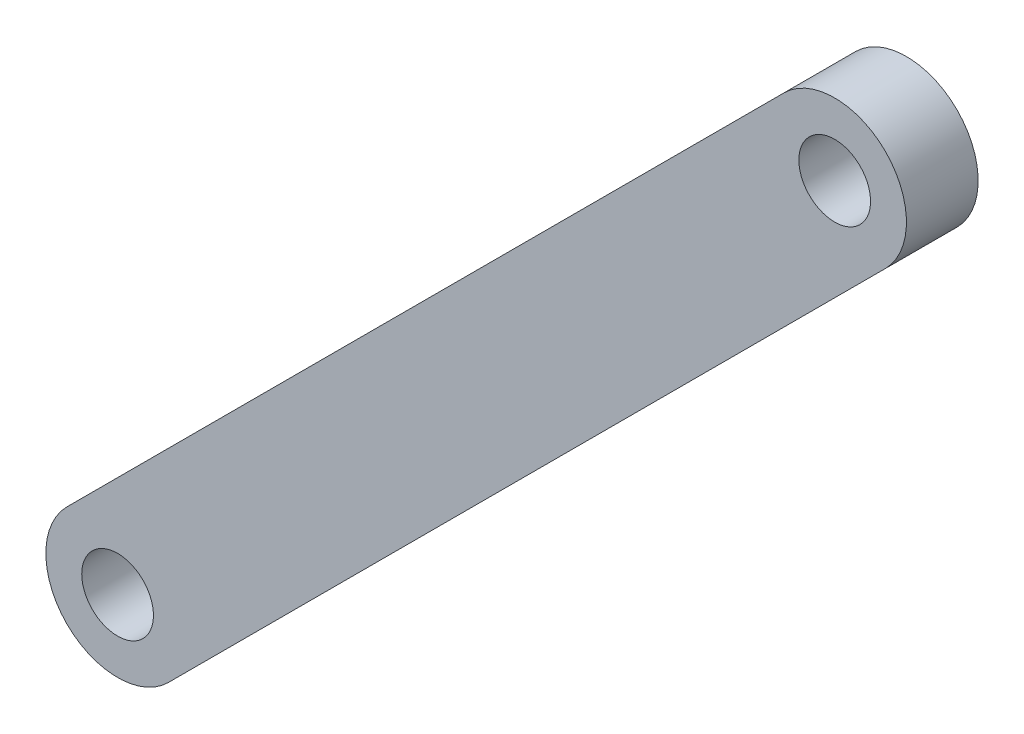
ISO-10303-21;
HEADER;
FILE_DESCRIPTION(('STEP AP214'),'2;1');
FILE_NAME('part.step','',(''),(''),'','','');
FILE_SCHEMA(('AUTOMOTIVE_DESIGN { 1 0 10303 214 1 1 1 1 }'));
ENDSEC;
DATA;
#1=APPLICATION_CONTEXT('core data for automotive mechanical design processes');
#2=APPLICATION_PROTOCOL_DEFINITION('international standard','automotive_design',2000,#1);
#3=PRODUCT_CONTEXT('',#1,'mechanical');
#4=PRODUCT('Part','Part','',(#3));
#5=PRODUCT_RELATED_PRODUCT_CATEGORY('part','',(#4));
#6=PRODUCT_DEFINITION_FORMATION('','',#4);
#7=PRODUCT_DEFINITION_CONTEXT('part definition',#1,'design');
#8=PRODUCT_DEFINITION('design','',#6,#7);
#9=PRODUCT_DEFINITION_SHAPE('','',#8);
#10=(LENGTH_UNIT() NAMED_UNIT(*) SI_UNIT(.MILLI.,.METRE.));
#11=(NAMED_UNIT(*) PLANE_ANGLE_UNIT() SI_UNIT($,.RADIAN.));
#12=(NAMED_UNIT(*) SI_UNIT($,.STERADIAN.) SOLID_ANGLE_UNIT());
#13=UNCERTAINTY_MEASURE_WITH_UNIT(LENGTH_MEASURE(1.E-05),#10,'distance_accuracy_value','');
#14=(GEOMETRIC_REPRESENTATION_CONTEXT(3) GLOBAL_UNCERTAINTY_ASSIGNED_CONTEXT((#13)) GLOBAL_UNIT_ASSIGNED_CONTEXT((#10,
#11,#12)) REPRESENTATION_CONTEXT('',''));
#15=CARTESIAN_POINT('',(0.,0.,0.));
#16=DIRECTION('',(0.,0.,1.));
#17=DIRECTION('',(1.,0.,0.));
#18=AXIS2_PLACEMENT_3D('',#15,#16,#17);
#19=CARTESIAN_POINT('',(0.,0.,-5.));
#20=DIRECTION('',(0.,0.,-1.));
#21=DIRECTION('',(-1.,0.,0.));
#22=AXIS2_PLACEMENT_3D('',#19,#20,#21);
#23=PLANE('',#22);
#24=CARTESIAN_POINT('',(0.,0.,-5.));
#25=DIRECTION('',(0.,0.,-1.));
#26=DIRECTION('',(-1.,0.,0.));
#27=AXIS2_PLACEMENT_3D('',#24,#25,#26);
#28=CIRCLE('',#27,2.5);
#29=CARTESIAN_POINT('',(-2.5,0.,-5.));
#30=VERTEX_POINT('',#29);
#31=EDGE_CURVE('E101',#30,#30,#28,.T.);
#32=ORIENTED_EDGE('',*,*,#31,.F.);
#33=EDGE_LOOP('',(#32));
#34=FACE_BOUND('',#33,.T.);
#35=CARTESIAN_POINT('',(0.,0.,-5.));
#36=DIRECTION('',(0.,0.,-1.));
#37=DIRECTION('',(-1.,0.,0.));
#38=AXIS2_PLACEMENT_3D('',#35,#36,#37);
#39=CIRCLE('',#38,5.);
#40=CARTESIAN_POINT('',(-3.53553390593272,3.53553390593276,-5.));
#41=VERTEX_POINT('',#40);
#42=CARTESIAN_POINT('',(3.53553390593272,-3.53553390593275,-5.));
#43=VERTEX_POINT('',#42);
#44=EDGE_CURVE('E86',#41,#43,#39,.T.);
#45=ORIENTED_EDGE('',*,*,#44,.T.);
#46=DIRECTION('',(-0.707106781186551,-0.707106781186544,0.));
#47=VECTOR('',#46,1.);
#48=CARTESIAN_POINT('',(3.53553390593272,-3.53553390593275,-5.));
#49=LINE('',#48,#47);
#50=CARTESIAN_POINT('',(-46.4644660940678,-53.5355339059328,-5.));
#51=VERTEX_POINT('',#50);
#52=EDGE_CURVE('E81',#43,#51,#49,.T.);
#53=ORIENTED_EDGE('',*,*,#52,.T.);
#54=CARTESIAN_POINT('',(-50.0000000000005,-50.,-5.));
#55=DIRECTION('',(0.,0.,-1.));
#56=DIRECTION('',(-1.,0.,0.));
#57=AXIS2_PLACEMENT_3D('',#54,#55,#56);
#58=CIRCLE('',#57,5.);
#59=CARTESIAN_POINT('',(-53.5355339059333,-46.4644660940673,-5.));
#60=VERTEX_POINT('',#59);
#61=EDGE_CURVE('E84',#51,#60,#58,.T.);
#62=ORIENTED_EDGE('',*,*,#61,.T.);
#63=DIRECTION('',(0.707106781186551,0.707106781186544,0.));
#64=VECTOR('',#63,1.);
#65=CARTESIAN_POINT('',(-3.53553390593272,3.53553390593276,-5.));
#66=LINE('',#65,#64);
#67=EDGE_CURVE('E51',#60,#41,#66,.T.);
#68=ORIENTED_EDGE('',*,*,#67,.T.);
#69=EDGE_LOOP('',(#45,#53,#62,#68));
#70=FACE_BOUND('',#69,.T.);
#71=CARTESIAN_POINT('',(-50.0000000000005,-50.,-5.));
#72=DIRECTION('',(0.,0.,-1.));
#73=DIRECTION('',(-1.,0.,0.));
#74=AXIS2_PLACEMENT_3D('',#71,#72,#73);
#75=CIRCLE('',#74,2.5);
#76=CARTESIAN_POINT('',(-52.5000000000005,-50.,-5.));
#77=VERTEX_POINT('',#76);
#78=EDGE_CURVE('E116',#77,#77,#75,.T.);
#79=ORIENTED_EDGE('',*,*,#78,.F.);
#80=EDGE_LOOP('',(#79));
#81=FACE_BOUND('',#80,.T.);
#82=ADVANCED_FACE('F34',(#34,#70,#81),#23,.T.);
#83=CARTESIAN_POINT('',(0.,0.,0.));
#84=DIRECTION('',(0.,0.,-1.));
#85=DIRECTION('',(-1.,0.,0.));
#86=AXIS2_PLACEMENT_3D('',#83,#84,#85);
#87=PLANE('',#86);
#88=CARTESIAN_POINT('',(0.,0.,0.));
#89=DIRECTION('',(0.,0.,-1.));
#90=DIRECTION('',(-1.,0.,0.));
#91=AXIS2_PLACEMENT_3D('',#88,#89,#90);
#92=CIRCLE('',#91,5.);
#93=CARTESIAN_POINT('',(-3.53553390593272,3.53553390593276,0.));
#94=VERTEX_POINT('',#93);
#95=CARTESIAN_POINT('',(3.53553390593272,-3.53553390593275,0.));
#96=VERTEX_POINT('',#95);
#97=EDGE_CURVE('E98',#94,#96,#92,.T.);
#98=ORIENTED_EDGE('',*,*,#97,.F.);
#99=DIRECTION('',(0.707106781186551,0.707106781186544,0.));
#100=VECTOR('',#99,1.);
#101=CARTESIAN_POINT('',(-3.53553390593272,3.53553390593276,0.));
#102=LINE('',#101,#100);
#103=CARTESIAN_POINT('',(-53.5355339059333,-46.4644660940673,0.));
#104=VERTEX_POINT('',#103);
#105=EDGE_CURVE('E74',#104,#94,#102,.T.);
#106=ORIENTED_EDGE('',*,*,#105,.F.);
#107=CARTESIAN_POINT('',(-50.0000000000005,-50.,0.));
#108=DIRECTION('',(0.,0.,-1.));
#109=DIRECTION('',(-1.,0.,0.));
#110=AXIS2_PLACEMENT_3D('',#107,#108,#109);
#111=CIRCLE('',#110,5.);
#112=CARTESIAN_POINT('',(-46.4644660940678,-53.5355339059328,0.));
#113=VERTEX_POINT('',#112);
#114=EDGE_CURVE('E68',#113,#104,#111,.T.);
#115=ORIENTED_EDGE('',*,*,#114,.F.);
#116=DIRECTION('',(-0.707106781186551,-0.707106781186544,0.));
#117=VECTOR('',#116,1.);
#118=CARTESIAN_POINT('',(3.53553390593272,-3.53553390593275,0.));
#119=LINE('',#118,#117);
#120=EDGE_CURVE('E90',#96,#113,#119,.T.);
#121=ORIENTED_EDGE('',*,*,#120,.F.);
#122=EDGE_LOOP('',(#98,#106,#115,#121));
#123=FACE_BOUND('',#122,.T.);
#124=CARTESIAN_POINT('',(0.,0.,0.));
#125=DIRECTION('',(0.,0.,-1.));
#126=DIRECTION('',(-1.,0.,0.));
#127=AXIS2_PLACEMENT_3D('',#124,#125,#126);
#128=CIRCLE('',#127,2.5);
#129=CARTESIAN_POINT('',(-2.5,0.,0.));
#130=VERTEX_POINT('',#129);
#131=EDGE_CURVE('E113',#130,#130,#128,.T.);
#132=ORIENTED_EDGE('',*,*,#131,.T.);
#133=EDGE_LOOP('',(#132));
#134=FACE_BOUND('',#133,.T.);
#135=CARTESIAN_POINT('',(-50.0000000000005,-50.,0.));
#136=DIRECTION('',(0.,0.,-1.));
#137=DIRECTION('',(-1.,0.,0.));
#138=AXIS2_PLACEMENT_3D('',#135,#136,#137);
#139=CIRCLE('',#138,2.5);
#140=CARTESIAN_POINT('',(-52.5000000000005,-50.,0.));
#141=VERTEX_POINT('',#140);
#142=EDGE_CURVE('E119',#141,#141,#139,.T.);
#143=ORIENTED_EDGE('',*,*,#142,.T.);
#144=EDGE_LOOP('',(#143));
#145=FACE_BOUND('',#144,.T.);
#146=ADVANCED_FACE('F109',(#123,#134,#145),#87,.F.);
#147=CARTESIAN_POINT('',(0.,0.,-5.));
#148=DIRECTION('',(0.,0.,1.));
#149=DIRECTION('',(1.,0.,0.));
#150=AXIS2_PLACEMENT_3D('',#147,#148,#149);
#151=CYLINDRICAL_SURFACE('',#150,5.);
#152=ORIENTED_EDGE('',*,*,#97,.T.);
#153=DIRECTION('',(0.,0.,1.));
#154=VECTOR('',#153,1.);
#155=CARTESIAN_POINT('',(3.53553390593272,-3.53553390593275,-5.));
#156=LINE('',#155,#154);
#157=EDGE_CURVE('E11',#43,#96,#156,.T.);
#158=ORIENTED_EDGE('',*,*,#157,.F.);
#159=ORIENTED_EDGE('',*,*,#44,.F.);
#160=DIRECTION('',(0.,0.,1.));
#161=VECTOR('',#160,1.);
#162=CARTESIAN_POINT('',(-3.53553390593272,3.53553390593276,-5.));
#163=LINE('',#162,#161);
#164=EDGE_CURVE('E94',#41,#94,#163,.T.);
#165=ORIENTED_EDGE('',*,*,#164,.T.);
#166=EDGE_LOOP('',(#152,#158,#159,#165));
#167=FACE_BOUND('',#166,.T.);
#168=ADVANCED_FACE('F36',(#167),#151,.T.);
#169=CARTESIAN_POINT('',(3.53553390593272,-3.53553390593275,-5.));
#170=DIRECTION('',(-0.707106781186544,0.707106781186551,0.));
#171=DIRECTION('',(-0.707106781186551,-0.707106781186544,0.));
#172=AXIS2_PLACEMENT_3D('',#169,#170,#171);
#173=PLANE('',#172);
#174=ORIENTED_EDGE('',*,*,#120,.T.);
#175=DIRECTION('',(0.,0.,1.));
#176=VECTOR('',#175,1.);
#177=CARTESIAN_POINT('',(-46.4644660940678,-53.5355339059328,-5.));
#178=LINE('',#177,#176);
#179=EDGE_CURVE('E43',#51,#113,#178,.T.);
#180=ORIENTED_EDGE('',*,*,#179,.F.);
#181=ORIENTED_EDGE('',*,*,#52,.F.);
#182=ORIENTED_EDGE('',*,*,#157,.T.);
#183=EDGE_LOOP('',(#174,#180,#181,#182));
#184=FACE_BOUND('',#183,.T.);
#185=ADVANCED_FACE('F89',(#184),#173,.F.);
#186=CARTESIAN_POINT('',(-50.0000000000005,-50.,-5.));
#187=DIRECTION('',(0.,0.,1.));
#188=DIRECTION('',(1.,0.,0.));
#189=AXIS2_PLACEMENT_3D('',#186,#187,#188);
#190=CYLINDRICAL_SURFACE('',#189,5.);
#191=ORIENTED_EDGE('',*,*,#114,.T.);
#192=DIRECTION('',(0.,0.,1.));
#193=VECTOR('',#192,1.);
#194=CARTESIAN_POINT('',(-53.5355339059333,-46.4644660940673,-5.));
#195=LINE('',#194,#193);
#196=EDGE_CURVE('E91',#60,#104,#195,.T.);
#197=ORIENTED_EDGE('',*,*,#196,.F.);
#198=ORIENTED_EDGE('',*,*,#61,.F.);
#199=ORIENTED_EDGE('',*,*,#179,.T.);
#200=EDGE_LOOP('',(#191,#197,#198,#199));
#201=FACE_BOUND('',#200,.T.);
#202=ADVANCED_FACE('F92',(#201),#190,.T.);
#203=CARTESIAN_POINT('',(-3.53553390593272,3.53553390593276,-5.));
#204=DIRECTION('',(0.707106781186544,-0.707106781186551,0.));
#205=DIRECTION('',(0.707106781186551,0.707106781186544,0.));
#206=AXIS2_PLACEMENT_3D('',#203,#204,#205);
#207=PLANE('',#206);
#208=ORIENTED_EDGE('',*,*,#105,.T.);
#209=ORIENTED_EDGE('',*,*,#164,.F.);
#210=ORIENTED_EDGE('',*,*,#67,.F.);
#211=ORIENTED_EDGE('',*,*,#196,.T.);
#212=EDGE_LOOP('',(#208,#209,#210,#211));
#213=FACE_BOUND('',#212,.T.);
#214=ADVANCED_FACE('F106',(#213),#207,.F.);
#215=CARTESIAN_POINT('',(0.,0.,-5.));
#216=DIRECTION('',(0.,0.,1.));
#217=DIRECTION('',(1.,0.,0.));
#218=AXIS2_PLACEMENT_3D('',#215,#216,#217);
#219=CYLINDRICAL_SURFACE('',#218,2.5);
#220=ORIENTED_EDGE('',*,*,#31,.T.);
#221=EDGE_LOOP('',(#220));
#222=FACE_BOUND('',#221,.T.);
#223=ORIENTED_EDGE('',*,*,#131,.F.);
#224=EDGE_LOOP('',(#223));
#225=FACE_BOUND('',#224,.T.);
#226=ADVANCED_FACE('F136',(#222,#225),#219,.F.);
#227=CARTESIAN_POINT('',(-50.0000000000005,-50.,-5.));
#228=DIRECTION('',(0.,0.,1.));
#229=DIRECTION('',(1.,0.,0.));
#230=AXIS2_PLACEMENT_3D('',#227,#228,#229);
#231=CYLINDRICAL_SURFACE('',#230,2.5);
#232=ORIENTED_EDGE('',*,*,#78,.T.);
#233=EDGE_LOOP('',(#232));
#234=FACE_BOUND('',#233,.T.);
#235=ORIENTED_EDGE('',*,*,#142,.F.);
#236=EDGE_LOOP('',(#235));
#237=FACE_BOUND('',#236,.T.);
#238=ADVANCED_FACE('F125',(#234,#237),#231,.F.);
#239=CLOSED_SHELL('',(#82,#146,#168,#185,#202,#214,#226,#238));
#240=MANIFOLD_SOLID_BREP('B2',#239);
#241=ADVANCED_BREP_SHAPE_REPRESENTATION('',(#18,#240),#14);
#242=SHAPE_DEFINITION_REPRESENTATION(#9,#241);
ENDSEC;
END-ISO-10303-21;
